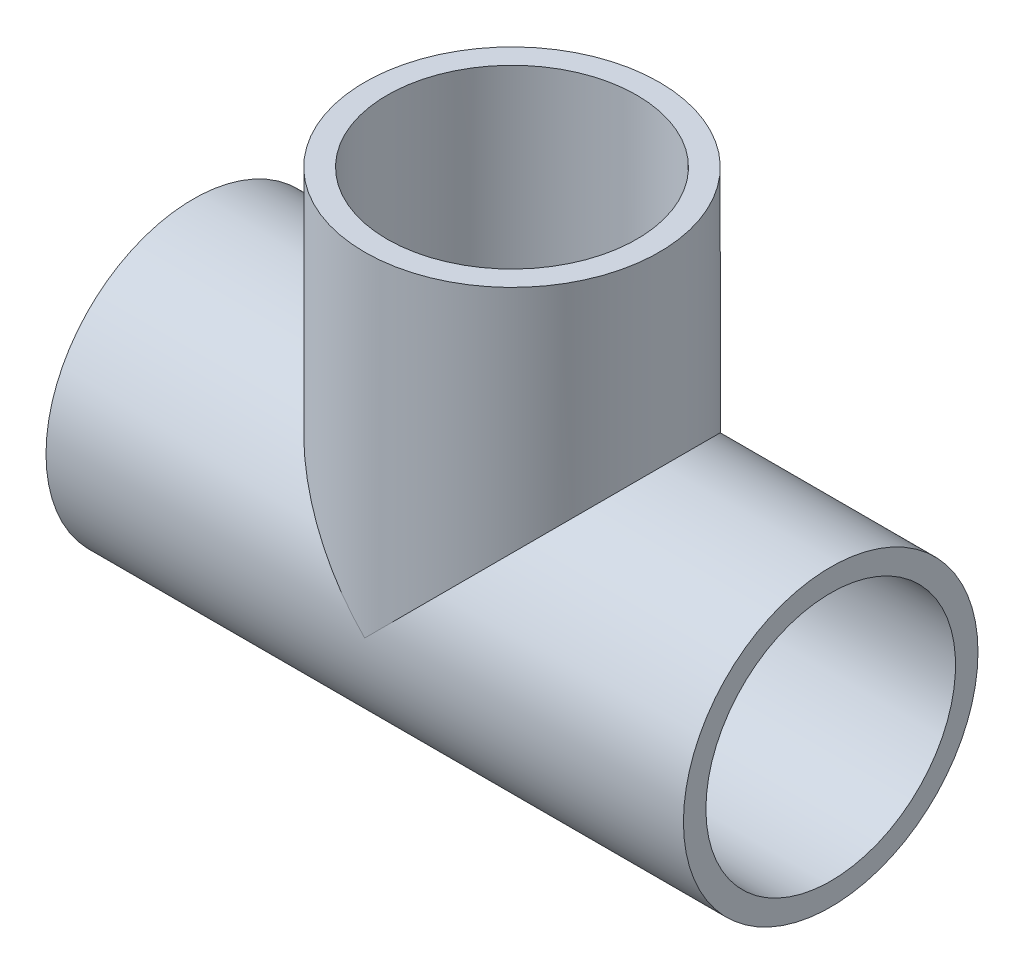
ISO-10303-21;
HEADER;
FILE_DESCRIPTION(('STEP AP214'),'2;1');
FILE_NAME('part.step','',(''),(''),'','','');
FILE_SCHEMA(('AUTOMOTIVE_DESIGN { 1 0 10303 214 1 1 1 1 }'));
ENDSEC;
DATA;
#1=APPLICATION_CONTEXT('core data for automotive mechanical design processes');
#2=APPLICATION_PROTOCOL_DEFINITION('international standard','automotive_design',2000,#1);
#3=PRODUCT_CONTEXT('',#1,'mechanical');
#4=PRODUCT('Part','Part','',(#3));
#5=PRODUCT_RELATED_PRODUCT_CATEGORY('part','',(#4));
#6=PRODUCT_DEFINITION_FORMATION('','',#4);
#7=PRODUCT_DEFINITION_CONTEXT('part definition',#1,'design');
#8=PRODUCT_DEFINITION('design','',#6,#7);
#9=PRODUCT_DEFINITION_SHAPE('','',#8);
#10=(LENGTH_UNIT() NAMED_UNIT(*) SI_UNIT(.MILLI.,.METRE.));
#11=(NAMED_UNIT(*) PLANE_ANGLE_UNIT() SI_UNIT($,.RADIAN.));
#12=(NAMED_UNIT(*) SI_UNIT($,.STERADIAN.) SOLID_ANGLE_UNIT());
#13=UNCERTAINTY_MEASURE_WITH_UNIT(LENGTH_MEASURE(1.E-05),#10,'distance_accuracy_value','');
#14=(GEOMETRIC_REPRESENTATION_CONTEXT(3) GLOBAL_UNCERTAINTY_ASSIGNED_CONTEXT((#13)) GLOBAL_UNIT_ASSIGNED_CONTEXT((#10,
#11,#12)) REPRESENTATION_CONTEXT('',''));
#15=CARTESIAN_POINT('',(0.,0.,0.));
#16=DIRECTION('',(0.,0.,1.));
#17=DIRECTION('',(1.,0.,0.));
#18=AXIS2_PLACEMENT_3D('',#15,#16,#17);
#19=CARTESIAN_POINT('',(227.,0.,0.));
#20=DIRECTION('',(-1.,0.,0.));
#21=DIRECTION('',(0.,0.,1.));
#22=AXIS2_PLACEMENT_3D('',#19,#20,#21);
#23=CYLINDRICAL_SURFACE('',#22,52.45);
#24=CARTESIAN_POINT('',(0.,0.,0.));
#25=DIRECTION('',(1.,0.,0.));
#26=DIRECTION('',(0.,0.,-1.));
#27=AXIS2_PLACEMENT_3D('',#24,#25,#26);
#28=CIRCLE('',#27,52.45);
#29=CARTESIAN_POINT('',(0.,0.,-52.45));
#30=VERTEX_POINT('',#29);
#31=EDGE_CURVE('E49',#30,#30,#28,.T.);
#32=ORIENTED_EDGE('',*,*,#31,.T.);
#33=EDGE_LOOP('',(#32));
#34=FACE_BOUND('',#33,.T.);
#35=CARTESIAN_POINT('',(227.,0.,0.));
#36=DIRECTION('',(1.,0.,0.));
#37=DIRECTION('',(0.,0.,-1.));
#38=AXIS2_PLACEMENT_3D('',#35,#36,#37);
#39=CIRCLE('',#38,52.45);
#40=CARTESIAN_POINT('',(227.,0.,-52.45));
#41=VERTEX_POINT('',#40);
#42=EDGE_CURVE('E13',#41,#41,#39,.T.);
#43=ORIENTED_EDGE('',*,*,#42,.F.);
#44=EDGE_LOOP('',(#43));
#45=FACE_BOUND('',#44,.T.);
#46=CARTESIAN_POINT('',(113.5,0.,0.));
#47=DIRECTION('',(-0.707106781186547,-0.707106781186548,0.));
#48=DIRECTION('',(-0.707106781186547,0.707106781186548,0.));
#49=AXIS2_PLACEMENT_3D('',#46,#47,#48);
#50=ELLIPSE('',#49,74.1755013464688,52.45);
#51=CARTESIAN_POINT('',(113.5,0.,-52.45));
#52=VERTEX_POINT('',#51);
#53=CARTESIAN_POINT('',(113.5,0.,52.45));
#54=VERTEX_POINT('',#53);
#55=EDGE_CURVE('E61',#52,#54,#50,.F.);
#56=ORIENTED_EDGE('',*,*,#55,.F.);
#57=CARTESIAN_POINT('',(113.5,0.,0.));
#58=DIRECTION('',(-0.707106781186547,0.707106781186548,0.));
#59=DIRECTION('',(-0.707106781186547,-0.707106781186548,0.));
#60=AXIS2_PLACEMENT_3D('',#57,#58,#59);
#61=ELLIPSE('',#60,74.1755013464688,52.45);
#62=EDGE_CURVE('E59',#54,#52,#61,.T.);
#63=ORIENTED_EDGE('',*,*,#62,.F.);
#64=EDGE_LOOP('',(#56,#63));
#65=FACE_BOUND('',#64,.T.);
#66=ADVANCED_FACE('F44',(#34,#45,#65),#23,.T.);
#67=CARTESIAN_POINT('',(227.,0.,0.));
#68=DIRECTION('',(1.,0.,0.));
#69=DIRECTION('',(0.,0.,-1.));
#70=AXIS2_PLACEMENT_3D('',#67,#68,#69);
#71=PLANE('',#70);
#72=ORIENTED_EDGE('',*,*,#42,.T.);
#73=EDGE_LOOP('',(#72));
#74=FACE_BOUND('',#73,.T.);
#75=CARTESIAN_POINT('',(227.,0.,0.));
#76=DIRECTION('',(1.,0.,0.));
#77=DIRECTION('',(0.,0.,-1.));
#78=AXIS2_PLACEMENT_3D('',#75,#76,#77);
#79=CIRCLE('',#78,44.45);
#80=CARTESIAN_POINT('',(227.,0.,44.45));
#81=VERTEX_POINT('',#80);
#82=EDGE_CURVE('E77',#81,#81,#79,.T.);
#83=ORIENTED_EDGE('',*,*,#82,.F.);
#84=EDGE_LOOP('',(#83));
#85=FACE_BOUND('',#84,.T.);
#86=ADVANCED_FACE('F97',(#74,#85),#71,.T.);
#87=CARTESIAN_POINT('',(0.,0.,0.));
#88=DIRECTION('',(1.,0.,0.));
#89=DIRECTION('',(0.,0.,-1.));
#90=AXIS2_PLACEMENT_3D('',#87,#88,#89);
#91=PLANE('',#90);
#92=ORIENTED_EDGE('',*,*,#31,.F.);
#93=EDGE_LOOP('',(#92));
#94=FACE_BOUND('',#93,.T.);
#95=CARTESIAN_POINT('',(0.,0.,0.));
#96=DIRECTION('',(1.,0.,0.));
#97=DIRECTION('',(0.,0.,-1.));
#98=AXIS2_PLACEMENT_3D('',#95,#96,#97);
#99=CIRCLE('',#98,44.45);
#100=CARTESIAN_POINT('',(0.,0.,44.45));
#101=VERTEX_POINT('',#100);
#102=EDGE_CURVE('E63',#101,#101,#99,.T.);
#103=ORIENTED_EDGE('',*,*,#102,.T.);
#104=EDGE_LOOP('',(#103));
#105=FACE_BOUND('',#104,.T.);
#106=ADVANCED_FACE('F83',(#94,#105),#91,.F.);
#107=CARTESIAN_POINT('',(113.5,119.,0.));
#108=DIRECTION('',(0.,-1.,0.));
#109=DIRECTION('',(0.,0.,-1.));
#110=AXIS2_PLACEMENT_3D('',#107,#108,#109);
#111=CYLINDRICAL_SURFACE('',#110,52.45);
#112=CARTESIAN_POINT('',(113.5,119.,0.));
#113=DIRECTION('',(0.,1.,0.));
#114=DIRECTION('',(0.,0.,1.));
#115=AXIS2_PLACEMENT_3D('',#112,#113,#114);
#116=CIRCLE('',#115,52.45);
#117=CARTESIAN_POINT('',(113.5,119.,52.45));
#118=VERTEX_POINT('',#117);
#119=EDGE_CURVE('E69',#118,#118,#116,.T.);
#120=ORIENTED_EDGE('',*,*,#119,.F.);
#121=EDGE_LOOP('',(#120));
#122=FACE_BOUND('',#121,.T.);
#123=ORIENTED_EDGE('',*,*,#62,.T.);
#124=ORIENTED_EDGE('',*,*,#55,.T.);
#125=EDGE_LOOP('',(#123,#124));
#126=FACE_BOUND('',#125,.T.);
#127=ADVANCED_FACE('F65',(#122,#126),#111,.T.);
#128=CARTESIAN_POINT('',(113.5,119.,0.));
#129=DIRECTION('',(0.,-1.,0.));
#130=DIRECTION('',(0.,0.,-1.));
#131=AXIS2_PLACEMENT_3D('',#128,#129,#130);
#132=CYLINDRICAL_SURFACE('',#131,44.45);
#133=CARTESIAN_POINT('',(113.5,119.,0.));
#134=DIRECTION('',(0.,1.,0.));
#135=DIRECTION('',(0.,0.,1.));
#136=AXIS2_PLACEMENT_3D('',#133,#134,#135);
#137=CIRCLE('',#136,44.45);
#138=CARTESIAN_POINT('',(113.5,119.,44.45));
#139=VERTEX_POINT('',#138);
#140=EDGE_CURVE('E131',#139,#139,#137,.T.);
#141=ORIENTED_EDGE('',*,*,#140,.T.);
#142=EDGE_LOOP('',(#141));
#143=FACE_BOUND('',#142,.T.);
#144=CARTESIAN_POINT('',(113.5,27.8424136884717,-44.45));
#145=CARTESIAN_POINT('',(112.737450461672,27.8424352635835,-44.4499922327911));
#146=CARTESIAN_POINT('',(111.974595064901,27.8739147220536,-44.4303165085724));
#147=CARTESIAN_POINT('',(110.455581976664,27.9981111972684,-44.3521520270499));
#148=CARTESIAN_POINT('',(109.699429646234,28.090873410873,-44.2936346233322));
#149=CARTESIAN_POINT('',(108.197773219562,28.333065737814,-44.1391030369463));
#150=CARTESIAN_POINT('',(107.452310227418,28.4826736501245,-44.0429711773838));
#151=CARTESIAN_POINT('',(105.97882733031,28.8314958718802,-43.8154147172636));
#152=CARTESIAN_POINT('',(105.250807181112,29.0307094863039,-43.6839906111807));
#153=CARTESIAN_POINT('',(103.523204465845,29.5603275609079,-43.3281449040483));
#154=CARTESIAN_POINT('',(102.533203598451,29.9111739528558,-43.0876225647992));
#155=CARTESIAN_POINT('',(100.594314494007,30.675090092683,-42.5471519661995));
#156=CARTESIAN_POINT('',(99.6454493552062,31.088194230997,-42.2471708334747));
#157=CARTESIAN_POINT('',(97.7858925777175,31.9602437833336,-41.591391096301));
#158=CARTESIAN_POINT('',(96.8753088889634,32.4193079037723,-41.2354465230831));
#159=CARTESIAN_POINT('',(95.093203461177,33.368267877382,-40.4713761607064));
#160=CARTESIAN_POINT('',(94.221679299596,33.8581618138836,-40.0632536137939));
#161=CARTESIAN_POINT('',(92.7338993693729,34.7299132266124,-39.3074857393874));
#162=CARTESIAN_POINT('',(92.1093233531577,35.1073879966042,-38.9710366754248));
#163=CARTESIAN_POINT('',(90.880173096224,35.8695408096627,-38.2706980101501));
#164=CARTESIAN_POINT('',(90.2756005815043,36.2542194698544,-37.9068060497697));
#165=CARTESIAN_POINT('',(89.0859354384023,37.0275876204249,-37.1517494231484));
#166=CARTESIAN_POINT('',(88.5008511105819,37.4162787297757,-36.760573349882));
#167=CARTESIAN_POINT('',(87.3503255908974,38.1945811041339,-35.9512405126404));
#168=CARTESIAN_POINT('',(86.7848838176238,38.5841923415408,-35.5330845483045));
#169=CARTESIAN_POINT('',(85.6742350925084,39.3613508917309,-34.6702080415285));
#170=CARTESIAN_POINT('',(85.1290099202354,39.748899779375,-34.2255124106263));
#171=CARTESIAN_POINT('',(84.0586431454811,40.5198205172596,-33.3092382141566));
#172=CARTESIAN_POINT('',(83.5335019463164,40.9031922835065,-32.8376591092014));
#173=CARTESIAN_POINT('',(81.9893475640322,42.0432858475033,-31.3828171504524));
#174=CARTESIAN_POINT('',(81.0008987502854,42.7904842314368,-30.3589031759793));
#175=CARTESIAN_POINT('',(79.3197951612477,44.0824792771995,-28.4388699870833));
#176=CARTESIAN_POINT('',(78.6096843409166,44.6358422053084,-27.5636744213671));
#177=CARTESIAN_POINT('',(77.2488736531271,45.7074185876455,-25.7477242597793));
#178=CARTESIAN_POINT('',(76.5981717002096,46.2256332755354,-24.8069719672238));
#179=CARTESIAN_POINT('',(75.3630459264292,47.2174984113232,-22.8626319994713));
#180=CARTESIAN_POINT('',(74.7785343461554,47.6912077218112,-21.8591303294881));
#181=CARTESIAN_POINT('',(73.6817757417309,48.5859073756299,-19.7909249982762));
#182=CARTESIAN_POINT('',(73.1695151093833,49.0069076448298,-18.726232915346));
#183=CARTESIAN_POINT('',(72.3087877862664,49.7178856509622,-16.7345560380486));
#184=CARTESIAN_POINT('',(71.9473899203618,50.0178528534156,-15.8167102712775));
#185=CARTESIAN_POINT('',(71.2829111093357,50.5712244143541,-13.9464806614937));
#186=CARTESIAN_POINT('',(70.9798239507018,50.8246337338564,-12.9941005112874));
#187=CARTESIAN_POINT('',(70.4362469051483,51.2802580576203,-11.0600274604268));
#188=CARTESIAN_POINT('',(70.1957322527807,51.4824933150924,-10.078346328763));
#189=CARTESIAN_POINT('',(69.7808755601312,51.8319334981467,-8.09138708291275));
#190=CARTESIAN_POINT('',(69.606534269407,51.9791378003831,-7.08610870157296));
#191=CARTESIAN_POINT('',(69.3263594552093,52.2159446531142,-5.05451785860807));
#192=CARTESIAN_POINT('',(69.2208440249139,52.3052797359117,-4.02813003499833));
#193=CARTESIAN_POINT('',(69.081532240224,52.4232667841813,-1.96699663497064));
#194=CARTESIAN_POINT('',(69.0477360373867,52.4519186214175,-0.932251040895685));
#195=CARTESIAN_POINT('',(69.052499492463,52.4478817732833,1.13689011644449));
#196=CARTESIAN_POINT('',(69.0910551485929,52.4151964804714,2.17128569590405));
#197=CARTESIAN_POINT('',(69.2397907325296,52.28923939575,4.23114414346743));
#198=CARTESIAN_POINT('',(69.3499678026354,52.195970021151,5.2566073663188));
#199=CARTESIAN_POINT('',(69.6293101913316,51.9599105775226,7.21608617157098));
#200=CARTESIAN_POINT('',(69.7935749621994,51.8212386674902,8.15130708512996));
#201=CARTESIAN_POINT('',(70.1794586886129,51.4961987375429,10.0012995613299));
#202=CARTESIAN_POINT('',(70.4010742054493,51.3098335772883,10.9160723464545));
#203=CARTESIAN_POINT('',(70.8986771587995,50.8925764536861,12.7202849007732));
#204=CARTESIAN_POINT('',(71.174666796238,50.6616826879429,13.6097236428419));
#205=CARTESIAN_POINT('',(71.7776698472956,50.1589983040196,15.3592301584086));
#206=CARTESIAN_POINT('',(72.104686442497,49.887205135758,16.2192960964043));
#207=CARTESIAN_POINT('',(72.8343738488893,49.2833427701614,17.974527006231));
#208=CARTESIAN_POINT('',(73.2410074787181,48.9481885298945,18.8669805462426));
#209=CARTESIAN_POINT('',(74.1053616165055,48.2397784017862,20.6109763879561));
#210=CARTESIAN_POINT('',(74.5630834860106,47.8665214984981,21.4625175984428));
#211=CARTESIAN_POINT('',(75.5258059138797,47.0867245421196,23.1232544217385));
#212=CARTESIAN_POINT('',(76.0308347891859,46.6801645730504,23.9324242143558));
#213=CARTESIAN_POINT('',(77.0842384061872,45.8389275590319,25.5067059470521));
#214=CARTESIAN_POINT('',(77.6326180101848,45.4042473610586,26.271812928277));
#215=CARTESIAN_POINT('',(79.0499010647076,44.2914463236392,28.1237274891446));
#216=CARTESIAN_POINT('',(79.9435146586144,43.5989788570319,29.1831258539131));
#217=CARTESIAN_POINT('',(81.8119363343623,42.1777730881429,31.2019619243351));
#218=CARTESIAN_POINT('',(82.7867817045589,41.4490181910629,32.1613532631886));
#219=CARTESIAN_POINT('',(84.3062867044585,40.3404663932676,33.5260204585538));
#220=CARTESIAN_POINT('',(84.8229180663586,39.9679677205655,33.9689451110041));
#221=CARTESIAN_POINT('',(85.8747002457807,39.2201512352084,34.8296872610833));
#222=CARTESIAN_POINT('',(86.4098496302452,38.8448336424539,35.247506694717));
#223=CARTESIAN_POINT('',(87.4983009278413,38.0937423592781,36.0579315470884));
#224=CARTESIAN_POINT('',(88.0515979429765,37.7179688178584,36.4505436859655));
#225=CARTESIAN_POINT('',(89.1764304165479,36.9683696984269,37.2105779388662));
#226=CARTESIAN_POINT('',(89.7479650036813,36.594544028345,37.5780012536572));
#227=CARTESIAN_POINT('',(91.2167126830511,35.6549843274127,38.4751973620239));
#228=CARTESIAN_POINT('',(92.1263135908031,35.0923113648457,38.9880675683611));
#229=CARTESIAN_POINT('',(93.9902511812189,33.9892004614891,39.9533963402957));
#230=CARTESIAN_POINT('',(94.9445929804797,33.4487650771382,40.4058479735052));
#231=CARTESIAN_POINT('',(96.8979198873887,32.4059910119059,41.2468378610189));
#232=CARTESIAN_POINT('',(97.8967916691893,31.9035635181028,41.6355277600571));
#233=CARTESIAN_POINT('',(99.9434237977985,30.9541570357918,42.3461188490773));
#234=CARTESIAN_POINT('',(100.991155551821,30.5071461642687,42.6680585150516));
#235=CARTESIAN_POINT('',(102.741220353009,29.842237694139,43.1340089512566));
#236=CARTESIAN_POINT('',(103.428734883508,29.6005711445894,43.2998940372737));
#237=CARTESIAN_POINT('',(104.822833124253,29.1557366201301,43.60066003391));
#238=CARTESIAN_POINT('',(105.529414434126,28.9525638247216,43.7355448270875));
#239=CARTESIAN_POINT('',(106.95819201815,28.5922844482359,43.9719259873107));
#240=CARTESIAN_POINT('',(107.68035149015,28.4350798516642,44.0734934523001));
#241=CARTESIAN_POINT('',(109.13822745847,28.1728819093581,44.2415599949704));
#242=CARTESIAN_POINT('',(109.873943458088,28.0678866546402,44.3080603548513));
#243=CARTESIAN_POINT('',(111.360684525008,27.914605913337,44.4047940103718));
#244=CARTESIAN_POINT('',(112.111788347195,27.8668573663514,44.4346839780728));
#245=CARTESIAN_POINT('',(113.615929097584,27.832502620049,44.4562114899257));
#246=CARTESIAN_POINT('',(114.368965939457,27.8458937361435,44.4478507136341));
#247=CARTESIAN_POINT('',(115.870798535671,27.933099380354,44.393096640366));
#248=CARTESIAN_POINT('',(116.619589631493,28.0069707641744,44.3466675564433));
#249=CARTESIAN_POINT('',(118.106153773111,28.2112390167057,44.2169981816368));
#250=CARTESIAN_POINT('',(118.843924973973,28.3416452430655,44.1337517967062));
#251=CARTESIAN_POINT('',(120.456881460496,28.6854316687482,43.9112593301478));
#252=CARTESIAN_POINT('',(121.328455598821,28.9104743926461,43.7639327512471));
#253=CARTESIAN_POINT('',(123.043971052391,29.4213454576333,43.4221257256575));
#254=CARTESIAN_POINT('',(123.887903995873,29.707192021636,43.2276311402615));
#255=CARTESIAN_POINT('',(125.548623190613,30.327779003756,42.7945302756241));
#256=CARTESIAN_POINT('',(126.365323901175,30.6626583939582,42.5557980868267));
#257=CARTESIAN_POINT('',(127.969123488833,31.3693657075339,42.037570364262));
#258=CARTESIAN_POINT('',(128.7562210342,31.7411952904156,41.758072999384));
#259=CARTESIAN_POINT('',(130.159987205962,32.4415839196548,41.2153489957788));
#260=CARTESIAN_POINT('',(130.781448649312,32.7655804488698,40.9585316098108));
#261=CARTESIAN_POINT('',(132.005949114823,33.4276052935358,40.420041499378));
#262=CARTESIAN_POINT('',(132.60898576051,33.7656354059189,40.1383655866693));
#263=CARTESIAN_POINT('',(133.797420549379,34.4521398308061,39.5506872489448));
#264=CARTESIAN_POINT('',(134.382809861776,34.8006192037301,39.2446729146722));
#265=CARTESIAN_POINT('',(135.53610328398,35.5046658437955,38.6088876615137));
#266=CARTESIAN_POINT('',(136.104008058872,35.8602328404854,38.2791176478535));
#267=CARTESIAN_POINT('',(137.223408306916,36.5761496395595,37.5956508426903));
#268=CARTESIAN_POINT('',(137.774882322077,36.9365048777607,37.2419245815254));
#269=CARTESIAN_POINT('',(138.860834492636,37.6591007820609,36.511079535515));
#270=CARTESIAN_POINT('',(139.395311144935,38.0213416116272,36.1339586905083));
#271=CARTESIAN_POINT('',(140.973039490722,39.1073410131933,34.967778264975));
#272=CARTESIAN_POINT('',(141.991089355079,39.8307003158887,34.1435954370655));
#273=CARTESIAN_POINT('',(143.48472697091,40.9165231696305,32.8204796517558));
#274=CARTESIAN_POINT('',(143.986033118103,41.2854743768602,32.3554306841848));
#275=CARTESIAN_POINT('',(144.969143606097,42.0166499832915,31.4000873286839));
#276=CARTESIAN_POINT('',(145.450947062158,42.3788740769153,30.9097917977318));
#277=CARTESIAN_POINT('',(146.866199698063,43.4525559421087,29.4007015621197));
#278=CARTESIAN_POINT('',(147.769545182069,44.1510629010094,28.3436554980686));
#279=CARTESIAN_POINT('',(149.056000037425,45.1592625017315,26.6844827476662));
#280=CARTESIAN_POINT('',(149.472947071033,45.4883766715421,26.1198552676208));
#281=CARTESIAN_POINT('',(150.283280143451,46.1318645336723,24.9657728632715));
#282=CARTESIAN_POINT('',(150.676667607037,46.4462391171239,24.3763194440053));
#283=CARTESIAN_POINT('',(151.438182326463,47.0579890249628,23.1733316553545));
#284=CARTESIAN_POINT('',(151.806323948706,47.3553740011021,22.5598112993074));
#285=CARTESIAN_POINT('',(152.516072671426,47.9313145712472,21.308821924858));
#286=CARTESIAN_POINT('',(152.857673655271,48.2098658228702,20.6713474358432));
#287=CARTESIAN_POINT('',(153.63126388059,48.8431429055775,19.1380503056477));
#288=CARTESIAN_POINT('',(154.051139548652,49.1888859937688,18.2323326853174));
#289=CARTESIAN_POINT('',(154.833600413772,49.8359121060648,16.3812392422875));
#290=CARTESIAN_POINT('',(155.196201067238,50.1372071236067,15.4358742064096));
#291=CARTESIAN_POINT('',(155.693592884359,50.5518639646945,13.9915197313785));
#292=CARTESIAN_POINT('',(155.851626897745,50.683858764216,13.5057271803336));
#293=CARTESIAN_POINT('',(156.15166373981,50.9348374447577,12.5259954053614));
#294=CARTESIAN_POINT('',(156.29366913699,51.0538234102774,12.0320575012635));
#295=CARTESIAN_POINT('',(156.694866284456,51.3904190010548,10.5388659288687));
#296=CARTESIAN_POINT('',(156.929276707915,51.5876978256857,9.52812530298971));
#297=CARTESIAN_POINT('',(157.329135289093,51.9247674330692,7.47715560490399));
#298=CARTESIAN_POINT('',(157.494154530827,52.0642005951797,6.43678437664985));
#299=CARTESIAN_POINT('',(157.750170874713,52.2807128710705,4.34046173373657));
#300=CARTESIAN_POINT('',(157.841168147464,52.3577921285595,3.28451035499109));
#301=CARTESIAN_POINT('',(157.947345691591,52.4477429821594,1.16631097265036));
#302=CARTESIAN_POINT('',(157.962543154186,52.4606291371156,0.104064451500017));
#303=CARTESIAN_POINT('',(157.916861164525,52.4219171327502,-2.01756594754296));
#304=CARTESIAN_POINT('',(157.855986642633,52.3703231525039,-3.07695000649752));
#305=CARTESIAN_POINT('',(157.66847644141,52.2116089824364,-5.08631486197805));
#306=CARTESIAN_POINT('',(157.548431841962,52.1100557015255,-6.0373653377459));
#307=CARTESIAN_POINT('',(157.248575545154,51.8568356924871,-7.9231322851874));
#308=CARTESIAN_POINT('',(157.068768287959,51.7051726873491,-8.85784996490421));
#309=CARTESIAN_POINT('',(156.651975057181,51.3544572672537,-10.7054491891782));
#310=CARTESIAN_POINT('',(156.414981420819,51.1553985014739,-11.6183277893398));
#311=CARTESIAN_POINT('',(155.886972510333,50.7132588199694,-13.417379820911));
#312=CARTESIAN_POINT('',(155.595954130712,50.4701753736003,-14.3035517137376));
#313=CARTESIAN_POINT('',(154.947842478632,49.9308499022713,-16.087995033622));
#314=CARTESIAN_POINT('',(154.5882097284,49.632586326031,-16.9847305578067));
#315=CARTESIAN_POINT('',(153.817413153316,48.9963923605573,-18.7410943206024));
#316=CARTESIAN_POINT('',(153.406249126673,48.6584618159917,-19.6007224138859));
#317=CARTESIAN_POINT('',(152.536362244924,47.9476243802979,-21.2804971109143));
#318=CARTESIAN_POINT('',(152.077638154083,47.5747165803933,-22.100642687989));
#319=CARTESIAN_POINT('',(151.11635210958,46.7986067282593,-23.6998578307509));
#320=CARTESIAN_POINT('',(150.613784652746,46.3954008739343,-24.4789222202243));
#321=CARTESIAN_POINT('',(149.316018636503,45.3626095635573,-26.360538872995));
#322=CARTESIAN_POINT('',(148.496535886344,44.7175882056157,-27.4380046376054));
#323=CARTESIAN_POINT('',(146.777594577555,43.3855155447086,-29.4992688358079));
#324=CARTESIAN_POINT('',(145.878102693854,42.6984467658515,-30.4830278824391));
#325=CARTESIAN_POINT('',(144.001916971243,41.2937960805706,-32.3605330990673));
#326=CARTESIAN_POINT('',(143.024920076688,40.5761000329385,-33.2538913630806));
#327=CARTESIAN_POINT('',(141.507358308059,39.4903521157083,-34.5228174030619));
#328=CARTESIAN_POINT('',(140.992814992756,39.1268942337945,-34.9339489542241));
#329=CARTESIAN_POINT('',(139.946484570463,38.3988952649479,-35.7326058127072));
#330=CARTESIAN_POINT('',(139.414698883783,38.0343542694704,-36.1201330568607));
#331=CARTESIAN_POINT('',(138.323339643527,37.2992271667711,-36.8789190911387));
#332=CARTESIAN_POINT('',(137.763425452913,36.9286629583772,-37.2497088478692));
#333=CARTESIAN_POINT('',(136.625602036015,36.1912380696515,-37.9665797713885));
#334=CARTESIAN_POINT('',(136.04769258736,35.8243774351602,-38.3126606326687));
#335=CARTESIAN_POINT('',(134.873194200363,35.0970177575505,-38.9800667354024));
#336=CARTESIAN_POINT('',(134.276593330553,34.7365230174235,-39.3013756917257));
#337=CARTESIAN_POINT('',(133.064597771616,34.0254701150383,-39.9185605646285));
#338=CARTESIAN_POINT('',(132.44920347441,33.6749117458596,-40.2144370110903));
#339=CARTESIAN_POINT('',(131.202054612228,32.9892818894292,-40.7787435162874));
#340=CARTESIAN_POINT('',(130.570395060129,32.6541428946458,-41.0473010371933));
#341=CARTESIAN_POINT('',(129.287106106517,32.0019889332059,-41.5577509699006));
#342=CARTESIAN_POINT('',(128.635474839978,31.6849756671594,-41.7996408816371));
#343=CARTESIAN_POINT('',(127.312604319717,31.074814695237,-42.2552145042571));
#344=CARTESIAN_POINT('',(126.641393063394,30.7816349837919,-42.4689362895591));
#345=CARTESIAN_POINT('',(125.278430902398,30.2249025870371,-42.8669434657992));
#346=CARTESIAN_POINT('',(124.586686870348,29.9613401266549,-43.0512385774132));
#347=CARTESIAN_POINT('',(123.193448523601,29.4744565132084,-43.3859993234317));
#348=CARTESIAN_POINT('',(122.492261818854,29.2505850203518,-43.536936205716));
#349=CARTESIAN_POINT('',(121.071376959247,28.8454916942798,-43.8063856364206));
#350=CARTESIAN_POINT('',(120.35167818741,28.6642712846062,-43.9248971026171));
#351=CARTESIAN_POINT('',(118.899301019366,28.3522744140072,-44.1269257978219));
#352=CARTESIAN_POINT('',(118.166679958496,28.2213152469779,-44.2105698717258));
#353=CARTESIAN_POINT('',(116.690691466052,28.0151345356793,-44.3415148886676));
#354=CARTESIAN_POINT('',(115.947332212179,27.9398726434216,-44.3888421411054));
#355=CARTESIAN_POINT('',(114.91856699798,27.877089297935,-44.4282641519708));
#356=CARTESIAN_POINT('',(114.635113483101,27.8641010893374,-44.4364094432474));
#357=CARTESIAN_POINT('',(114.067787490977,27.8467584599166,-44.4472793206643));
#358=CARTESIAN_POINT('',(113.783914945244,27.8424056555553,-44.4500028919127));
#359=CARTESIAN_POINT('',(113.5,27.8424136884717,-44.45));
#360=B_SPLINE_CURVE_WITH_KNOTS('',3,(#144,#145,#146,#147,#148,#149,#150,#151,#152,#153,#154,
#155,#156,#157,#158,#159,#160,#161,#162,#163,#164,#165,#166,#167,#168,#169,#170,#171,#172,#173,
#174,#175,#176,#177,#178,#179,#180,#181,#182,#183,#184,#185,#186,#187,#188,#189,#190,#191,#192,
#193,#194,#195,#196,#197,#198,#199,#200,#201,#202,#203,#204,#205,#206,#207,#208,#209,#210,#211,
#212,#213,#214,#215,#216,#217,#218,#219,#220,#221,#222,#223,#224,#225,#226,#227,#228,#229,#230,
#231,#232,#233,#234,#235,#236,#237,#238,#239,#240,#241,#242,#243,#244,#245,#246,#247,#248,#249,
#250,#251,#252,#253,#254,#255,#256,#257,#258,#259,#260,#261,#262,#263,#264,#265,#266,#267,#268,
#269,#270,#271,#272,#273,#274,#275,#276,#277,#278,#279,#280,#281,#282,#283,#284,#285,#286,#287,
#288,#289,#290,#291,#292,#293,#294,#295,#296,#297,#298,#299,#300,#301,#302,#303,#304,#305,#306,
#307,#308,#309,#310,#311,#312,#313,#314,#315,#316,#317,#318,#319,#320,#321,#322,#323,#324,#325,
#326,#327,#328,#329,#330,#331,#332,#333,#334,#335,#336,#337,#338,#339,#340,#341,#342,#343,#344,
#345,#346,#347,#348,#349,#350,#351,#352,#353,#354,#355,#356,#357,#358,#359),.UNSPECIFIED.,.T.,
.F.,(4,2,2,2,2,2,2,2,2,2,2,2,2,2,2,2,2,2,2,2,2,2,2,2,2,2,2,2,2,2,2,2,2,2,2,2,2,2,2,2,2,2,2,2,2,
2,2,2,2,2,2,2,2,2,2,2,2,2,2,2,2,2,2,2,2,2,2,2,2,2,2,2,2,2,2,2,2,2,2,2,2,2,2,2,2,2,2,2,2,2,2,2,2,
2,2,2,2,2,2,2,2,2,2,2,2,2,2,4),(0.,2.28730145675847,4.57629171526588,6.87250108949285,
9.16867829352836,12.3958957504,15.624902462331,18.8624755150881,22.099847488518,
24.5099430101792,26.9202459470789,29.3315627020514,31.7428080223857,34.1518245708909,
36.560889470732,41.3759638740483,45.13950437874,48.9029127191615,52.6612713792287,
56.418921218449,59.5090002973512,62.5987499188863,65.6872747877324,68.7758346398115,
71.8785696373669,74.9813111916167,78.0838811381893,81.1863272995336,84.0619944185086,
86.9374891544926,89.8131003070353,92.6888908285281,95.7951629881859,98.9015179525021,
102.009744341996,105.118319852244,109.759775930239,114.403374468903,116.730215435531,
119.056876735452,121.382915161161,123.708842625918,127.264829666484,130.821224368756,
134.36903425385,137.914793399281,140.155403290118,142.395732407962,144.631249165719,
146.866684177978,149.12292617762,151.37906910862,153.637335411213,155.895975644913,
158.628043391931,161.360931096315,164.101720101097,166.842632255949,169.081107368492,
171.319869996276,173.559734914124,175.79951452556,178.042101274206,180.28488578942,
184.768452137575,187.09882745917,189.429308379963,194.090024219701,196.414995060337,
198.739825155191,201.06332111109,203.387350967944,206.553705866413,209.719204817448,
211.301678842145,212.883898922801,216.047981291975,219.23134358234,222.414698535909,
225.597331479152,228.779758160837,231.668334552371,234.556696380315,237.445445454008,
240.334360632673,243.364874441682,246.395400118313,249.42600455566,252.456989940017,
256.94899746663,261.442884825862,265.955303223477,268.211609714219,270.467730815416,
272.768165017113,275.068627657186,277.370589956647,279.672504283441,281.963131834132,
284.253973946859,286.541687093278,288.828642956292,291.080867926379,293.333168057083,
295.577201436833,297.819607607685,298.67106381921,299.522679399854),.UNSPECIFIED.);
#361=CARTESIAN_POINT('',(113.5,27.8424136884717,-44.45));
#362=VERTEX_POINT('',#361);
#363=EDGE_CURVE('E66',#362,#362,#360,.T.);
#364=ORIENTED_EDGE('',*,*,#363,.F.);
#365=EDGE_LOOP('',(#364));
#366=FACE_BOUND('',#365,.T.);
#367=ADVANCED_FACE('F114',(#143,#366),#132,.F.);
#368=CARTESIAN_POINT('',(113.5,119.,0.));
#369=DIRECTION('',(0.,1.,0.));
#370=DIRECTION('',(0.,0.,1.));
#371=AXIS2_PLACEMENT_3D('',#368,#369,#370);
#372=PLANE('',#371);
#373=ORIENTED_EDGE('',*,*,#119,.T.);
#374=EDGE_LOOP('',(#373));
#375=FACE_BOUND('',#374,.T.);
#376=ORIENTED_EDGE('',*,*,#140,.F.);
#377=EDGE_LOOP('',(#376));
#378=FACE_BOUND('',#377,.T.);
#379=ADVANCED_FACE('F92',(#375,#378),#372,.T.);
#380=ORIENTED_EDGE('',*,*,#363,.T.);
#381=EDGE_LOOP('',(#380));
#382=FACE_BOUND('',#381,.T.);
#383=ADVANCED_FACE('F46',(#382),#23,.T.);
#384=CARTESIAN_POINT('',(227.,0.,0.));
#385=DIRECTION('',(-1.,0.,0.));
#386=DIRECTION('',(0.,0.,1.));
#387=AXIS2_PLACEMENT_3D('',#384,#385,#386);
#388=CYLINDRICAL_SURFACE('',#387,44.45);
#389=CARTESIAN_POINT('',(227.,0.,44.45));
#390=CARTESIAN_POINT('',(224.635416666667,0.,44.45));
#391=CARTESIAN_POINT('',(222.270833333333,0.,44.45));
#392=CARTESIAN_POINT('',(217.541666666667,0.,44.45));
#393=CARTESIAN_POINT('',(215.177083333333,0.,44.45));
#394=CARTESIAN_POINT('',(210.447916666667,0.,44.45));
#395=CARTESIAN_POINT('',(208.083333333333,0.,44.45));
#396=CARTESIAN_POINT('',(203.354166666667,0.,44.45));
#397=CARTESIAN_POINT('',(200.989583333333,0.,44.45));
#398=CARTESIAN_POINT('',(196.260416666667,0.,44.45));
#399=CARTESIAN_POINT('',(193.895833333333,0.,44.45));
#400=CARTESIAN_POINT('',(189.166666666667,0.,44.45));
#401=CARTESIAN_POINT('',(186.802083333333,0.,44.45));
#402=CARTESIAN_POINT('',(182.072916666667,0.,44.45));
#403=CARTESIAN_POINT('',(179.708333333333,0.,44.45));
#404=CARTESIAN_POINT('',(174.979166666667,0.,44.45));
#405=CARTESIAN_POINT('',(172.614583333333,0.,44.45));
#406=CARTESIAN_POINT('',(167.885416666667,0.,44.45));
#407=CARTESIAN_POINT('',(165.520833333333,0.,44.45));
#408=CARTESIAN_POINT('',(160.791666666667,0.,44.45));
#409=CARTESIAN_POINT('',(158.427083333333,0.,44.45));
#410=CARTESIAN_POINT('',(153.697916666667,0.,44.45));
#411=CARTESIAN_POINT('',(151.333333333333,0.,44.45));
#412=CARTESIAN_POINT('',(146.604166666667,0.,44.45));
#413=CARTESIAN_POINT('',(144.239583333333,0.,44.45));
#414=CARTESIAN_POINT('',(139.510416666667,0.,44.45));
#415=CARTESIAN_POINT('',(137.145833333333,0.,44.45));
#416=CARTESIAN_POINT('',(132.416666666667,0.,44.45));
#417=CARTESIAN_POINT('',(130.052083333333,0.,44.45));
#418=CARTESIAN_POINT('',(125.322916666667,0.,44.45));
#419=CARTESIAN_POINT('',(122.958333333333,0.,44.45));
#420=CARTESIAN_POINT('',(118.229166666667,0.,44.45));
#421=CARTESIAN_POINT('',(115.864583333333,0.,44.45));
#422=CARTESIAN_POINT('',(111.135416666667,0.,44.45));
#423=CARTESIAN_POINT('',(108.770833333333,0.,44.45));
#424=CARTESIAN_POINT('',(104.041666666667,0.,44.45));
#425=CARTESIAN_POINT('',(101.677083333333,0.,44.45));
#426=CARTESIAN_POINT('',(96.9479166666667,0.,44.45));
#427=CARTESIAN_POINT('',(94.5833333333333,0.,44.45));
#428=CARTESIAN_POINT('',(89.8541666666667,0.,44.45));
#429=CARTESIAN_POINT('',(87.4895833333333,0.,44.45));
#430=CARTESIAN_POINT('',(82.7604166666667,0.,44.45));
#431=CARTESIAN_POINT('',(80.3958333333333,0.,44.45));
#432=CARTESIAN_POINT('',(75.6666666666667,0.,44.45));
#433=CARTESIAN_POINT('',(73.3020833333333,0.,44.45));
#434=CARTESIAN_POINT('',(68.5729166666667,0.,44.45));
#435=CARTESIAN_POINT('',(66.2083333333333,0.,44.45));
#436=CARTESIAN_POINT('',(61.4791666666667,0.,44.45));
#437=CARTESIAN_POINT('',(59.1145833333333,0.,44.45));
#438=CARTESIAN_POINT('',(54.3854166666667,0.,44.45));
#439=CARTESIAN_POINT('',(52.0208333333333,0.,44.45));
#440=CARTESIAN_POINT('',(47.2916666666667,0.,44.45));
#441=CARTESIAN_POINT('',(44.9270833333333,0.,44.45));
#442=CARTESIAN_POINT('',(40.1979166666667,0.,44.45));
#443=CARTESIAN_POINT('',(37.8333333333333,0.,44.45));
#444=CARTESIAN_POINT('',(33.1041666666667,0.,44.45));
#445=CARTESIAN_POINT('',(30.7395833333333,0.,44.45));
#446=CARTESIAN_POINT('',(26.0104166666667,0.,44.45));
#447=CARTESIAN_POINT('',(23.6458333333333,0.,44.45));
#448=CARTESIAN_POINT('',(18.9166666666667,0.,44.45));
#449=CARTESIAN_POINT('',(16.5520833333333,0.,44.45));
#450=CARTESIAN_POINT('',(11.8229166666667,0.,44.45));
#451=CARTESIAN_POINT('',(9.45833333333334,0.,44.45));
#452=CARTESIAN_POINT('',(4.72916666666667,0.,44.45));
#453=CARTESIAN_POINT('',(2.36458333333333,0.,44.45));
#454=CARTESIAN_POINT('',(0.,0.,44.45));
#455=B_SPLINE_CURVE_WITH_KNOTS('',3,(#389,#390,#391,#392,#393,#394,#395,#396,#397,#398,#399,
#400,#401,#402,#403,#404,#405,#406,#407,#408,#409,#410,#411,#412,#413,#414,#415,#416,#417,#418,
#419,#420,#421,#422,#423,#424,#425,#426,#427,#428,#429,#430,#431,#432,#433,#434,#435,#436,#437,
#438,#439,#440,#441,#442,#443,#444,#445,#446,#447,#448,#449,#450,#451,#452,#453,#454),
.UNSPECIFIED.,.F.,.F.,(4,2,2,2,2,2,2,2,2,2,2,2,2,2,2,2,2,2,2,2,2,2,2,2,2,2,2,2,2,2,2,2,4),(0.,
7.09374999999998,14.1875,21.28125,28.375,35.46875,42.5625,49.65625,56.75,63.84375,70.9375,
78.03125,85.125,92.21875,99.3125,106.40625,113.5,120.59375,127.6875,134.78125,141.875,148.96875,
156.0625,163.15625,170.25,177.34375,184.4375,191.53125,198.625,205.71875,212.8125,219.90625,
227.),.UNSPECIFIED.);
#456=EDGE_CURVE('BSEAM85',#81,#101,#455,.T.);
#457=ORIENTED_EDGE('',*,*,#82,.T.);
#458=ORIENTED_EDGE('',*,*,#102,.F.);
#459=ORIENTED_EDGE('',*,*,#456,.T.);
#460=ORIENTED_EDGE('',*,*,#456,.F.);
#461=EDGE_LOOP('',(#457,#459,#458,#460));
#462=FACE_BOUND('',#461,.T.);
#463=ADVANCED_FACE('F85',(#462),#388,.F.);
#464=CLOSED_SHELL('',(#66,#86,#106,#127,#367,#379,#383,#463));
#465=MANIFOLD_SOLID_BREP('B2',#464);
#466=ADVANCED_BREP_SHAPE_REPRESENTATION('',(#18,#465),#14);
#467=SHAPE_DEFINITION_REPRESENTATION(#9,#466);
ENDSEC;
END-ISO-10303-21;
